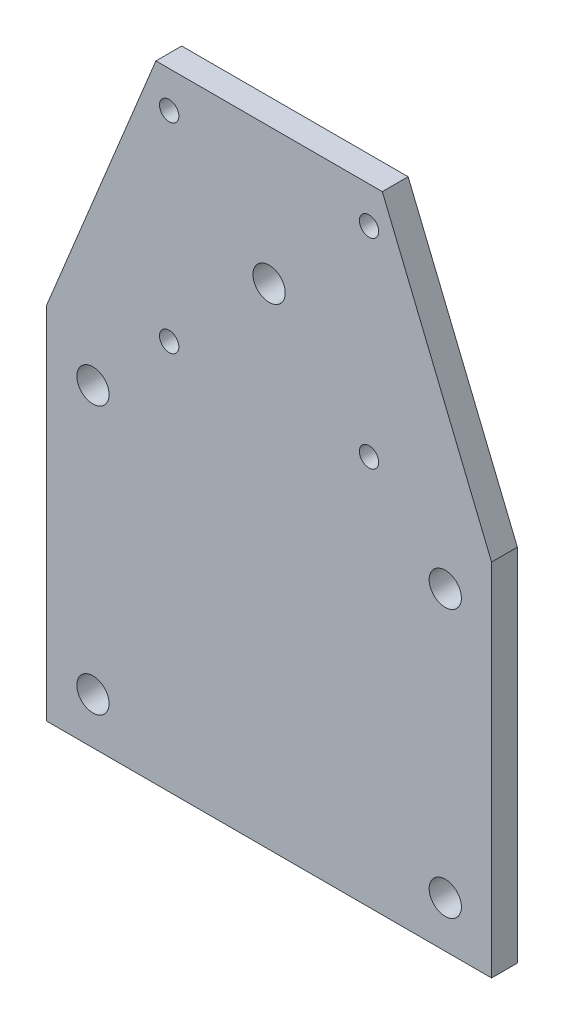
ISO-10303-21;
HEADER;
FILE_DESCRIPTION(('STEP AP214'),'2;1');
FILE_NAME('part.step','',(''),(''),'','','');
FILE_SCHEMA(('AUTOMOTIVE_DESIGN { 1 0 10303 214 1 1 1 1 }'));
ENDSEC;
DATA;
#1=APPLICATION_CONTEXT('core data for automotive mechanical design processes');
#2=APPLICATION_PROTOCOL_DEFINITION('international standard','automotive_design',2000,#1);
#3=PRODUCT_CONTEXT('',#1,'mechanical');
#4=PRODUCT('Part','Part','',(#3));
#5=PRODUCT_RELATED_PRODUCT_CATEGORY('part','',(#4));
#6=PRODUCT_DEFINITION_FORMATION('','',#4);
#7=PRODUCT_DEFINITION_CONTEXT('part definition',#1,'design');
#8=PRODUCT_DEFINITION('design','',#6,#7);
#9=PRODUCT_DEFINITION_SHAPE('','',#8);
#10=(LENGTH_UNIT() NAMED_UNIT(*) SI_UNIT(.MILLI.,.METRE.));
#11=(NAMED_UNIT(*) PLANE_ANGLE_UNIT() SI_UNIT($,.RADIAN.));
#12=(NAMED_UNIT(*) SI_UNIT($,.STERADIAN.) SOLID_ANGLE_UNIT());
#13=UNCERTAINTY_MEASURE_WITH_UNIT(LENGTH_MEASURE(1.E-05),#10,'distance_accuracy_value','');
#14=(GEOMETRIC_REPRESENTATION_CONTEXT(3) GLOBAL_UNCERTAINTY_ASSIGNED_CONTEXT((#13)) GLOBAL_UNIT_ASSIGNED_CONTEXT((#10,
#11,#12)) REPRESENTATION_CONTEXT('',''));
#15=CARTESIAN_POINT('',(0.,0.,0.));
#16=DIRECTION('',(0.,0.,1.));
#17=DIRECTION('',(1.,0.,0.));
#18=AXIS2_PLACEMENT_3D('',#15,#16,#17);
#19=CARTESIAN_POINT('',(-34.5047129725438,0.,4.));
#20=DIRECTION('',(1.,0.,0.));
#21=DIRECTION('',(0.,1.,0.));
#22=AXIS2_PLACEMENT_3D('',#19,#20,#21);
#23=PLANE('',#22);
#24=DIRECTION('',(0.,-1.,0.));
#25=VECTOR('',#24,1.);
#26=CARTESIAN_POINT('',(-34.5047129725438,0.,0.));
#27=LINE('',#26,#25);
#28=CARTESIAN_POINT('',(-34.5047129725438,-20.1363031788332,0.));
#29=VERTEX_POINT('',#28);
#30=CARTESIAN_POINT('',(-34.5047129725438,-76.0047129725436,0.));
#31=VERTEX_POINT('',#30);
#32=EDGE_CURVE('E158',#29,#31,#27,.T.);
#33=ORIENTED_EDGE('',*,*,#32,.T.);
#34=DIRECTION('',(0.,0.,-1.));
#35=VECTOR('',#34,1.);
#36=CARTESIAN_POINT('',(-34.5047129725438,-76.0047129725436,4.));
#37=LINE('',#36,#35);
#38=CARTESIAN_POINT('',(-34.5047129725438,-76.0047129725436,4.));
#39=VERTEX_POINT('',#38);
#40=EDGE_CURVE('E11',#39,#31,#37,.T.);
#41=ORIENTED_EDGE('',*,*,#40,.F.);
#42=DIRECTION('',(0.,-1.,0.));
#43=VECTOR('',#42,1.);
#44=CARTESIAN_POINT('',(-34.5047129725438,0.,4.));
#45=LINE('',#44,#43);
#46=CARTESIAN_POINT('',(-34.5047129725438,-20.1363031788332,4.));
#47=VERTEX_POINT('',#46);
#48=EDGE_CURVE('E403',#47,#39,#45,.T.);
#49=ORIENTED_EDGE('',*,*,#48,.F.);
#50=DIRECTION('',(0.,0.,-1.));
#51=VECTOR('',#50,1.);
#52=CARTESIAN_POINT('',(-34.5047129725438,-20.1363031788332,4.));
#53=LINE('',#52,#51);
#54=EDGE_CURVE('E62',#47,#29,#53,.T.);
#55=ORIENTED_EDGE('',*,*,#54,.T.);
#56=EDGE_LOOP('',(#33,#41,#49,#55));
#57=FACE_BOUND('',#56,.T.);
#58=ADVANCED_FACE('F45',(#57),#23,.F.);
#59=CARTESIAN_POINT('',(0.,-76.0047129725436,4.));
#60=DIRECTION('',(0.,1.,0.));
#61=DIRECTION('',(-1.,0.,0.));
#62=AXIS2_PLACEMENT_3D('',#59,#60,#61);
#63=PLANE('',#62);
#64=DIRECTION('',(1.,0.,0.));
#65=VECTOR('',#64,1.);
#66=CARTESIAN_POINT('',(0.,-76.0047129725436,0.));
#67=LINE('',#66,#65);
#68=CARTESIAN_POINT('',(34.5047129725438,-76.0047129725436,0.));
#69=VERTEX_POINT('',#68);
#70=EDGE_CURVE('E160',#31,#69,#67,.T.);
#71=ORIENTED_EDGE('',*,*,#70,.T.);
#72=DIRECTION('',(0.,0.,-1.));
#73=VECTOR('',#72,1.);
#74=CARTESIAN_POINT('',(34.5047129725438,-76.0047129725436,4.));
#75=LINE('',#74,#73);
#76=CARTESIAN_POINT('',(34.5047129725438,-76.0047129725436,4.));
#77=VERTEX_POINT('',#76);
#78=EDGE_CURVE('E54',#77,#69,#75,.T.);
#79=ORIENTED_EDGE('',*,*,#78,.F.);
#80=DIRECTION('',(1.,0.,0.));
#81=VECTOR('',#80,1.);
#82=CARTESIAN_POINT('',(0.,-76.0047129725436,4.));
#83=LINE('',#82,#81);
#84=EDGE_CURVE('E94',#39,#77,#83,.T.);
#85=ORIENTED_EDGE('',*,*,#84,.F.);
#86=ORIENTED_EDGE('',*,*,#40,.T.);
#87=EDGE_LOOP('',(#71,#79,#85,#86));
#88=FACE_BOUND('',#87,.T.);
#89=ADVANCED_FACE('F193',(#88),#63,.F.);
#90=CARTESIAN_POINT('',(34.5047129725438,0.,4.));
#91=DIRECTION('',(1.,0.,0.));
#92=DIRECTION('',(0.,0.,-1.));
#93=AXIS2_PLACEMENT_3D('',#90,#91,#92);
#94=PLANE('',#93);
#95=DIRECTION('',(0.,-1.,0.));
#96=VECTOR('',#95,1.);
#97=CARTESIAN_POINT('',(34.5047129725438,0.,0.));
#98=LINE('',#97,#96);
#99=CARTESIAN_POINT('',(34.5047129725438,-20.1363031788332,0.));
#100=VERTEX_POINT('',#99);
#101=EDGE_CURVE('E163',#100,#69,#98,.T.);
#102=ORIENTED_EDGE('',*,*,#101,.F.);
#103=DIRECTION('',(0.,0.,-1.));
#104=VECTOR('',#103,1.);
#105=CARTESIAN_POINT('',(34.5047129725438,-20.1363031788332,4.));
#106=LINE('',#105,#104);
#107=CARTESIAN_POINT('',(34.5047129725438,-20.1363031788332,4.));
#108=VERTEX_POINT('',#107);
#109=EDGE_CURVE('E113',#108,#100,#106,.T.);
#110=ORIENTED_EDGE('',*,*,#109,.F.);
#111=DIRECTION('',(0.,-1.,0.));
#112=VECTOR('',#111,1.);
#113=CARTESIAN_POINT('',(34.5047129725438,0.,4.));
#114=LINE('',#113,#112);
#115=EDGE_CURVE('E123',#108,#77,#114,.T.);
#116=ORIENTED_EDGE('',*,*,#115,.T.);
#117=ORIENTED_EDGE('',*,*,#78,.T.);
#118=EDGE_LOOP('',(#102,#110,#116,#117));
#119=FACE_BOUND('',#118,.T.);
#120=ADVANCED_FACE('F192',(#119),#94,.T.);
#121=CARTESIAN_POINT('',(22.4558516840694,9.21746788425806,4.));
#122=DIRECTION('',(0.925099008851072,0.379725985182427,0.));
#123=DIRECTION('',(-0.379725985182427,0.925099008851072,0.));
#124=AXIS2_PLACEMENT_3D('',#121,#122,#123);
#125=PLANE('',#124);
#126=DIRECTION('',(0.379725985182427,-0.925099008851072,0.));
#127=VECTOR('',#126,1.);
#128=CARTESIAN_POINT('',(22.4558516840694,9.21746788425806,0.));
#129=LINE('',#128,#127);
#130=CARTESIAN_POINT('',(17.5578975515723,21.15,0.));
#131=VERTEX_POINT('',#130);
#132=EDGE_CURVE('E109',#131,#100,#129,.T.);
#133=ORIENTED_EDGE('',*,*,#132,.F.);
#134=DIRECTION('',(0.,0.,-1.));
#135=VECTOR('',#134,1.);
#136=CARTESIAN_POINT('',(17.5578975515723,21.15,4.));
#137=LINE('',#136,#135);
#138=CARTESIAN_POINT('',(17.5578975515723,21.15,4.));
#139=VERTEX_POINT('',#138);
#140=EDGE_CURVE('E104',#139,#131,#137,.T.);
#141=ORIENTED_EDGE('',*,*,#140,.F.);
#142=DIRECTION('',(0.379725985182427,-0.925099008851072,0.));
#143=VECTOR('',#142,1.);
#144=CARTESIAN_POINT('',(22.4558516840694,9.21746788425806,4.));
#145=LINE('',#144,#143);
#146=EDGE_CURVE('E107',#139,#108,#145,.T.);
#147=ORIENTED_EDGE('',*,*,#146,.T.);
#148=ORIENTED_EDGE('',*,*,#109,.T.);
#149=EDGE_LOOP('',(#133,#141,#147,#148));
#150=FACE_BOUND('',#149,.T.);
#151=ADVANCED_FACE('F106',(#150),#125,.T.);
#152=CARTESIAN_POINT('',(0.,21.15,4.));
#153=DIRECTION('',(0.,1.,0.));
#154=DIRECTION('',(0.,0.,1.));
#155=AXIS2_PLACEMENT_3D('',#152,#153,#154);
#156=PLANE('',#155);
#157=DIRECTION('',(1.,0.,0.));
#158=VECTOR('',#157,1.);
#159=CARTESIAN_POINT('',(0.,21.15,0.));
#160=LINE('',#159,#158);
#161=CARTESIAN_POINT('',(-17.5578975515723,21.15,0.));
#162=VERTEX_POINT('',#161);
#163=EDGE_CURVE('E167',#162,#131,#160,.T.);
#164=ORIENTED_EDGE('',*,*,#163,.F.);
#165=DIRECTION('',(0.,0.,-1.));
#166=VECTOR('',#165,1.);
#167=CARTESIAN_POINT('',(-17.5578975515723,21.15,4.));
#168=LINE('',#167,#166);
#169=CARTESIAN_POINT('',(-17.5578975515723,21.15,4.));
#170=VERTEX_POINT('',#169);
#171=EDGE_CURVE('E82',#170,#162,#168,.T.);
#172=ORIENTED_EDGE('',*,*,#171,.F.);
#173=DIRECTION('',(1.,0.,0.));
#174=VECTOR('',#173,1.);
#175=CARTESIAN_POINT('',(0.,21.15,4.));
#176=LINE('',#175,#174);
#177=EDGE_CURVE('E121',#170,#139,#176,.T.);
#178=ORIENTED_EDGE('',*,*,#177,.T.);
#179=ORIENTED_EDGE('',*,*,#140,.T.);
#180=EDGE_LOOP('',(#164,#172,#178,#179));
#181=FACE_BOUND('',#180,.T.);
#182=ADVANCED_FACE('F125',(#181),#156,.T.);
#183=CARTESIAN_POINT('',(-15.5,15.5,4.));
#184=DIRECTION('',(0.,0.,-1.));
#185=DIRECTION('',(-1.,0.,0.));
#186=AXIS2_PLACEMENT_3D('',#183,#184,#185);
#187=CYLINDRICAL_SURFACE('',#186,1.5);
#188=CARTESIAN_POINT('',(-15.5,15.5,4.));
#189=DIRECTION('',(0.,0.,1.));
#190=DIRECTION('',(1.,0.,0.));
#191=AXIS2_PLACEMENT_3D('',#188,#189,#190);
#192=CIRCLE('',#191,1.5);
#193=CARTESIAN_POINT('',(-14.,15.5,4.));
#194=VERTEX_POINT('',#193);
#195=EDGE_CURVE('E140',#194,#194,#192,.T.);
#196=ORIENTED_EDGE('',*,*,#195,.T.);
#197=EDGE_LOOP('',(#196));
#198=FACE_BOUND('',#197,.T.);
#199=CARTESIAN_POINT('',(-15.5,15.5,0.));
#200=DIRECTION('',(0.,0.,1.));
#201=DIRECTION('',(1.,0.,0.));
#202=AXIS2_PLACEMENT_3D('',#199,#200,#201);
#203=CIRCLE('',#202,1.5);
#204=CARTESIAN_POINT('',(-14.,15.5,0.));
#205=VERTEX_POINT('',#204);
#206=EDGE_CURVE('E181',#205,#205,#203,.T.);
#207=ORIENTED_EDGE('',*,*,#206,.F.);
#208=EDGE_LOOP('',(#207));
#209=FACE_BOUND('',#208,.T.);
#210=ADVANCED_FACE('F257',(#198,#209),#187,.F.);
#211=CARTESIAN_POINT('',(15.5,15.5,4.));
#212=DIRECTION('',(0.,0.,-1.));
#213=DIRECTION('',(-1.,0.,0.));
#214=AXIS2_PLACEMENT_3D('',#211,#212,#213);
#215=CYLINDRICAL_SURFACE('',#214,1.5);
#216=CARTESIAN_POINT('',(15.5,15.5,4.));
#217=DIRECTION('',(0.,0.,1.));
#218=DIRECTION('',(1.,0.,0.));
#219=AXIS2_PLACEMENT_3D('',#216,#217,#218);
#220=CIRCLE('',#219,1.5);
#221=CARTESIAN_POINT('',(17.,15.5,4.));
#222=VERTEX_POINT('',#221);
#223=EDGE_CURVE('E137',#222,#222,#220,.T.);
#224=ORIENTED_EDGE('',*,*,#223,.T.);
#225=EDGE_LOOP('',(#224));
#226=FACE_BOUND('',#225,.T.);
#227=CARTESIAN_POINT('',(15.5,15.5,0.));
#228=DIRECTION('',(0.,0.,1.));
#229=DIRECTION('',(1.,0.,0.));
#230=AXIS2_PLACEMENT_3D('',#227,#228,#229);
#231=CIRCLE('',#230,1.5);
#232=CARTESIAN_POINT('',(17.,15.5,0.));
#233=VERTEX_POINT('',#232);
#234=EDGE_CURVE('E178',#233,#233,#231,.T.);
#235=ORIENTED_EDGE('',*,*,#234,.F.);
#236=EDGE_LOOP('',(#235));
#237=FACE_BOUND('',#236,.T.);
#238=ADVANCED_FACE('F260',(#226,#237),#215,.F.);
#239=CARTESIAN_POINT('',(15.5,-15.5,4.));
#240=DIRECTION('',(0.,0.,-1.));
#241=DIRECTION('',(-1.,0.,0.));
#242=AXIS2_PLACEMENT_3D('',#239,#240,#241);
#243=CYLINDRICAL_SURFACE('',#242,1.5);
#244=CARTESIAN_POINT('',(15.5,-15.5,4.));
#245=DIRECTION('',(0.,0.,1.));
#246=DIRECTION('',(1.,0.,0.));
#247=AXIS2_PLACEMENT_3D('',#244,#245,#246);
#248=CIRCLE('',#247,1.5);
#249=CARTESIAN_POINT('',(17.,-15.5,4.));
#250=VERTEX_POINT('',#249);
#251=EDGE_CURVE('E134',#250,#250,#248,.T.);
#252=ORIENTED_EDGE('',*,*,#251,.T.);
#253=EDGE_LOOP('',(#252));
#254=FACE_BOUND('',#253,.T.);
#255=CARTESIAN_POINT('',(15.5,-15.5,0.));
#256=DIRECTION('',(0.,0.,1.));
#257=DIRECTION('',(1.,0.,0.));
#258=AXIS2_PLACEMENT_3D('',#255,#256,#257);
#259=CIRCLE('',#258,1.5);
#260=CARTESIAN_POINT('',(17.,-15.5,0.));
#261=VERTEX_POINT('',#260);
#262=EDGE_CURVE('E175',#261,#261,#259,.T.);
#263=ORIENTED_EDGE('',*,*,#262,.F.);
#264=EDGE_LOOP('',(#263));
#265=FACE_BOUND('',#264,.T.);
#266=ADVANCED_FACE('F210',(#254,#265),#243,.F.);
#267=CARTESIAN_POINT('',(0.,0.,4.));
#268=DIRECTION('',(0.,0.,-1.));
#269=DIRECTION('',(-1.,0.,0.));
#270=AXIS2_PLACEMENT_3D('',#267,#268,#269);
#271=CYLINDRICAL_SURFACE('',#270,2.5);
#272=CARTESIAN_POINT('',(0.,0.,4.));
#273=DIRECTION('',(0.,0.,1.));
#274=DIRECTION('',(1.,0.,0.));
#275=AXIS2_PLACEMENT_3D('',#272,#273,#274);
#276=CIRCLE('',#275,2.5);
#277=CARTESIAN_POINT('',(2.50000000000001,0.,4.));
#278=VERTEX_POINT('',#277);
#279=EDGE_CURVE('E128',#278,#278,#276,.T.);
#280=ORIENTED_EDGE('',*,*,#279,.T.);
#281=EDGE_LOOP('',(#280));
#282=FACE_BOUND('',#281,.T.);
#283=CARTESIAN_POINT('',(0.,0.,0.));
#284=DIRECTION('',(0.,0.,1.));
#285=DIRECTION('',(1.,0.,0.));
#286=AXIS2_PLACEMENT_3D('',#283,#284,#285);
#287=CIRCLE('',#286,2.5);
#288=CARTESIAN_POINT('',(2.50000000000001,0.,0.));
#289=VERTEX_POINT('',#288);
#290=EDGE_CURVE('E172',#289,#289,#287,.T.);
#291=ORIENTED_EDGE('',*,*,#290,.F.);
#292=EDGE_LOOP('',(#291));
#293=FACE_BOUND('',#292,.T.);
#294=ADVANCED_FACE('F201',(#282,#293),#271,.F.);
#295=CARTESIAN_POINT('',(-22.4558516840694,9.21746788425805,4.));
#296=DIRECTION('',(-0.925099008851072,0.379725985182427,0.));
#297=DIRECTION('',(-0.379725985182427,-0.925099008851072,0.));
#298=AXIS2_PLACEMENT_3D('',#295,#296,#297);
#299=PLANE('',#298);
#300=DIRECTION('',(0.379725985182427,0.925099008851072,0.));
#301=VECTOR('',#300,1.);
#302=CARTESIAN_POINT('',(-22.4558516840694,9.21746788425805,0.));
#303=LINE('',#302,#301);
#304=EDGE_CURVE('E169',#29,#162,#303,.T.);
#305=ORIENTED_EDGE('',*,*,#304,.F.);
#306=ORIENTED_EDGE('',*,*,#54,.F.);
#307=DIRECTION('',(0.379725985182427,0.925099008851072,0.));
#308=VECTOR('',#307,1.);
#309=CARTESIAN_POINT('',(-22.4558516840694,9.21746788425805,4.));
#310=LINE('',#309,#308);
#311=EDGE_CURVE('E126',#47,#170,#310,.T.);
#312=ORIENTED_EDGE('',*,*,#311,.T.);
#313=ORIENTED_EDGE('',*,*,#171,.T.);
#314=EDGE_LOOP('',(#305,#306,#312,#313));
#315=FACE_BOUND('',#314,.T.);
#316=ADVANCED_FACE('F198',(#315),#299,.T.);
#317=CARTESIAN_POINT('',(-27.3205080756884,-27.3205080756884,4.));
#318=DIRECTION('',(0.,0.,-1.));
#319=DIRECTION('',(-1.,0.,0.));
#320=AXIS2_PLACEMENT_3D('',#317,#318,#319);
#321=CYLINDRICAL_SURFACE('',#320,2.5);
#322=CARTESIAN_POINT('',(-27.3205080756884,-27.3205080756884,4.));
#323=DIRECTION('',(0.,0.,1.));
#324=DIRECTION('',(1.,0.,0.));
#325=AXIS2_PLACEMENT_3D('',#322,#323,#324);
#326=CIRCLE('',#325,2.5);
#327=CARTESIAN_POINT('',(-24.8205080756884,-27.3205080756884,4.));
#328=VERTEX_POINT('',#327);
#329=EDGE_CURVE('E402',#328,#328,#326,.T.);
#330=ORIENTED_EDGE('',*,*,#329,.T.);
#331=EDGE_LOOP('',(#330));
#332=FACE_BOUND('',#331,.T.);
#333=CARTESIAN_POINT('',(-27.3205080756884,-27.3205080756884,0.));
#334=DIRECTION('',(0.,0.,1.));
#335=DIRECTION('',(1.,0.,0.));
#336=AXIS2_PLACEMENT_3D('',#333,#334,#335);
#337=CIRCLE('',#336,2.5);
#338=CARTESIAN_POINT('',(-24.8205080756884,-27.3205080756884,0.));
#339=VERTEX_POINT('',#338);
#340=EDGE_CURVE('E155',#339,#339,#337,.T.);
#341=ORIENTED_EDGE('',*,*,#340,.F.);
#342=EDGE_LOOP('',(#341));
#343=FACE_BOUND('',#342,.T.);
#344=ADVANCED_FACE('F200',(#332,#343),#321,.F.);
#345=CARTESIAN_POINT('',(27.3205080756885,-27.3205080756884,4.));
#346=DIRECTION('',(0.,0.,-1.));
#347=DIRECTION('',(-1.,0.,0.));
#348=AXIS2_PLACEMENT_3D('',#345,#346,#347);
#349=CYLINDRICAL_SURFACE('',#348,2.50000000000002);
#350=CARTESIAN_POINT('',(27.3205080756885,-27.3205080756884,4.));
#351=DIRECTION('',(0.,0.,1.));
#352=DIRECTION('',(1.,0.,0.));
#353=AXIS2_PLACEMENT_3D('',#350,#351,#352);
#354=CIRCLE('',#353,2.50000000000002);
#355=CARTESIAN_POINT('',(29.8205080756885,-27.3205080756884,4.));
#356=VERTEX_POINT('',#355);
#357=EDGE_CURVE('E399',#356,#356,#354,.F.);
#358=ORIENTED_EDGE('',*,*,#357,.F.);
#359=EDGE_LOOP('',(#358));
#360=FACE_BOUND('',#359,.T.);
#361=CARTESIAN_POINT('',(27.3205080756885,-27.3205080756884,0.));
#362=DIRECTION('',(0.,0.,1.));
#363=DIRECTION('',(1.,0.,0.));
#364=AXIS2_PLACEMENT_3D('',#361,#362,#363);
#365=CIRCLE('',#364,2.50000000000002);
#366=CARTESIAN_POINT('',(29.8205080756885,-27.3205080756884,0.));
#367=VERTEX_POINT('',#366);
#368=EDGE_CURVE('E152',#367,#367,#365,.F.);
#369=ORIENTED_EDGE('',*,*,#368,.T.);
#370=EDGE_LOOP('',(#369));
#371=FACE_BOUND('',#370,.T.);
#372=ADVANCED_FACE('F207',(#360,#371),#349,.F.);
#373=CARTESIAN_POINT('',(27.3205080756885,-68.8205080756884,4.));
#374=DIRECTION('',(0.,0.,-1.));
#375=DIRECTION('',(-1.,0.,0.));
#376=AXIS2_PLACEMENT_3D('',#373,#374,#375);
#377=CYLINDRICAL_SURFACE('',#376,2.50000000000001);
#378=CARTESIAN_POINT('',(27.3205080756885,-68.8205080756884,4.));
#379=DIRECTION('',(0.,0.,1.));
#380=DIRECTION('',(1.,0.,0.));
#381=AXIS2_PLACEMENT_3D('',#378,#379,#380);
#382=CIRCLE('',#381,2.50000000000001);
#383=CARTESIAN_POINT('',(29.8205080756885,-68.8205080756884,4.));
#384=VERTEX_POINT('',#383);
#385=EDGE_CURVE('E235',#384,#384,#382,.T.);
#386=ORIENTED_EDGE('',*,*,#385,.T.);
#387=EDGE_LOOP('',(#386));
#388=FACE_BOUND('',#387,.T.);
#389=CARTESIAN_POINT('',(27.3205080756885,-68.8205080756884,0.));
#390=DIRECTION('',(0.,0.,1.));
#391=DIRECTION('',(1.,0.,0.));
#392=AXIS2_PLACEMENT_3D('',#389,#390,#391);
#393=CIRCLE('',#392,2.50000000000001);
#394=CARTESIAN_POINT('',(29.8205080756885,-68.8205080756884,0.));
#395=VERTEX_POINT('',#394);
#396=EDGE_CURVE('E149',#395,#395,#393,.T.);
#397=ORIENTED_EDGE('',*,*,#396,.F.);
#398=EDGE_LOOP('',(#397));
#399=FACE_BOUND('',#398,.T.);
#400=ADVANCED_FACE('F223',(#388,#399),#377,.F.);
#401=CARTESIAN_POINT('',(-27.3205080756884,-68.8205080756884,4.));
#402=DIRECTION('',(0.,0.,-1.));
#403=DIRECTION('',(-1.,0.,0.));
#404=AXIS2_PLACEMENT_3D('',#401,#402,#403);
#405=CYLINDRICAL_SURFACE('',#404,2.5);
#406=CARTESIAN_POINT('',(-27.3205080756884,-68.8205080756884,4.));
#407=DIRECTION('',(0.,0.,1.));
#408=DIRECTION('',(1.,0.,0.));
#409=AXIS2_PLACEMENT_3D('',#406,#407,#408);
#410=CIRCLE('',#409,2.5);
#411=CARTESIAN_POINT('',(-24.8205080756884,-68.8205080756884,4.));
#412=VERTEX_POINT('',#411);
#413=EDGE_CURVE('E187',#412,#412,#410,.F.);
#414=ORIENTED_EDGE('',*,*,#413,.F.);
#415=EDGE_LOOP('',(#414));
#416=FACE_BOUND('',#415,.T.);
#417=CARTESIAN_POINT('',(-27.3205080756884,-68.8205080756884,0.));
#418=DIRECTION('',(0.,0.,1.));
#419=DIRECTION('',(1.,0.,0.));
#420=AXIS2_PLACEMENT_3D('',#417,#418,#419);
#421=CIRCLE('',#420,2.5);
#422=CARTESIAN_POINT('',(-24.8205080756884,-68.8205080756884,0.));
#423=VERTEX_POINT('',#422);
#424=EDGE_CURVE('E146',#423,#423,#421,.F.);
#425=ORIENTED_EDGE('',*,*,#424,.T.);
#426=EDGE_LOOP('',(#425));
#427=FACE_BOUND('',#426,.T.);
#428=ADVANCED_FACE('F47',(#416,#427),#405,.F.);
#429=CARTESIAN_POINT('',(-15.5,-15.5,4.));
#430=DIRECTION('',(0.,0.,-1.));
#431=DIRECTION('',(-1.,0.,0.));
#432=AXIS2_PLACEMENT_3D('',#429,#430,#431);
#433=CYLINDRICAL_SURFACE('',#432,1.5);
#434=CARTESIAN_POINT('',(-15.5,-15.5,4.));
#435=DIRECTION('',(0.,0.,1.));
#436=DIRECTION('',(1.,0.,0.));
#437=AXIS2_PLACEMENT_3D('',#434,#435,#436);
#438=CIRCLE('',#437,1.5);
#439=CARTESIAN_POINT('',(-14.,-15.5,4.));
#440=VERTEX_POINT('',#439);
#441=EDGE_CURVE('E143',#440,#440,#438,.T.);
#442=ORIENTED_EDGE('',*,*,#441,.T.);
#443=EDGE_LOOP('',(#442));
#444=FACE_BOUND('',#443,.T.);
#445=CARTESIAN_POINT('',(-15.5,-15.5,0.));
#446=DIRECTION('',(0.,0.,1.));
#447=DIRECTION('',(1.,0.,0.));
#448=AXIS2_PLACEMENT_3D('',#445,#446,#447);
#449=CIRCLE('',#448,1.5);
#450=CARTESIAN_POINT('',(-14.,-15.5,0.));
#451=VERTEX_POINT('',#450);
#452=EDGE_CURVE('E184',#451,#451,#449,.T.);
#453=ORIENTED_EDGE('',*,*,#452,.F.);
#454=EDGE_LOOP('',(#453));
#455=FACE_BOUND('',#454,.T.);
#456=ADVANCED_FACE('F230',(#444,#455),#433,.F.);
#457=CARTESIAN_POINT('',(0.,0.,4.));
#458=DIRECTION('',(0.,0.,1.));
#459=DIRECTION('',(1.,0.,0.));
#460=AXIS2_PLACEMENT_3D('',#457,#458,#459);
#461=PLANE('',#460);
#462=ORIENTED_EDGE('',*,*,#413,.T.);
#463=EDGE_LOOP('',(#462));
#464=FACE_BOUND('',#463,.T.);
#465=ORIENTED_EDGE('',*,*,#385,.F.);
#466=EDGE_LOOP('',(#465));
#467=FACE_BOUND('',#466,.T.);
#468=ORIENTED_EDGE('',*,*,#357,.T.);
#469=EDGE_LOOP('',(#468));
#470=FACE_BOUND('',#469,.T.);
#471=ORIENTED_EDGE('',*,*,#329,.F.);
#472=EDGE_LOOP('',(#471));
#473=FACE_BOUND('',#472,.T.);
#474=ORIENTED_EDGE('',*,*,#48,.T.);
#475=ORIENTED_EDGE('',*,*,#84,.T.);
#476=ORIENTED_EDGE('',*,*,#115,.F.);
#477=ORIENTED_EDGE('',*,*,#146,.F.);
#478=ORIENTED_EDGE('',*,*,#177,.F.);
#479=ORIENTED_EDGE('',*,*,#311,.F.);
#480=EDGE_LOOP('',(#474,#475,#476,#477,#478,#479));
#481=FACE_BOUND('',#480,.T.);
#482=ORIENTED_EDGE('',*,*,#279,.F.);
#483=EDGE_LOOP('',(#482));
#484=FACE_BOUND('',#483,.T.);
#485=ORIENTED_EDGE('',*,*,#251,.F.);
#486=EDGE_LOOP('',(#485));
#487=FACE_BOUND('',#486,.T.);
#488=ORIENTED_EDGE('',*,*,#223,.F.);
#489=EDGE_LOOP('',(#488));
#490=FACE_BOUND('',#489,.T.);
#491=ORIENTED_EDGE('',*,*,#195,.F.);
#492=EDGE_LOOP('',(#491));
#493=FACE_BOUND('',#492,.T.);
#494=ORIENTED_EDGE('',*,*,#441,.F.);
#495=EDGE_LOOP('',(#494));
#496=FACE_BOUND('',#495,.T.);
#497=ADVANCED_FACE('F118',(#464,#467,#470,#473,#481,#484,#487,#490,#493,#496),#461,.T.);
#498=CARTESIAN_POINT('',(0.,0.,0.));
#499=DIRECTION('',(0.,0.,1.));
#500=DIRECTION('',(1.,0.,0.));
#501=AXIS2_PLACEMENT_3D('',#498,#499,#500);
#502=PLANE('',#501);
#503=ORIENTED_EDGE('',*,*,#424,.F.);
#504=EDGE_LOOP('',(#503));
#505=FACE_BOUND('',#504,.T.);
#506=ORIENTED_EDGE('',*,*,#396,.T.);
#507=EDGE_LOOP('',(#506));
#508=FACE_BOUND('',#507,.T.);
#509=ORIENTED_EDGE('',*,*,#368,.F.);
#510=EDGE_LOOP('',(#509));
#511=FACE_BOUND('',#510,.T.);
#512=ORIENTED_EDGE('',*,*,#340,.T.);
#513=EDGE_LOOP('',(#512));
#514=FACE_BOUND('',#513,.T.);
#515=ORIENTED_EDGE('',*,*,#32,.F.);
#516=ORIENTED_EDGE('',*,*,#304,.T.);
#517=ORIENTED_EDGE('',*,*,#163,.T.);
#518=ORIENTED_EDGE('',*,*,#132,.T.);
#519=ORIENTED_EDGE('',*,*,#101,.T.);
#520=ORIENTED_EDGE('',*,*,#70,.F.);
#521=EDGE_LOOP('',(#515,#516,#517,#518,#519,#520));
#522=FACE_BOUND('',#521,.T.);
#523=ORIENTED_EDGE('',*,*,#290,.T.);
#524=EDGE_LOOP('',(#523));
#525=FACE_BOUND('',#524,.T.);
#526=ORIENTED_EDGE('',*,*,#262,.T.);
#527=EDGE_LOOP('',(#526));
#528=FACE_BOUND('',#527,.T.);
#529=ORIENTED_EDGE('',*,*,#234,.T.);
#530=EDGE_LOOP('',(#529));
#531=FACE_BOUND('',#530,.T.);
#532=ORIENTED_EDGE('',*,*,#206,.T.);
#533=EDGE_LOOP('',(#532));
#534=FACE_BOUND('',#533,.T.);
#535=ORIENTED_EDGE('',*,*,#452,.T.);
#536=EDGE_LOOP('',(#535));
#537=FACE_BOUND('',#536,.T.);
#538=ADVANCED_FACE('F196',(#505,#508,#511,#514,#522,#525,#528,#531,#534,#537),#502,.F.);
#539=CLOSED_SHELL('',(#58,#89,#120,#151,#182,#210,#238,#266,#294,#316,#344,#372,#400,#428,#456,
#497,#538));
#540=MANIFOLD_SOLID_BREP('B2',#539);
#541=ADVANCED_BREP_SHAPE_REPRESENTATION('',(#18,#540),#14);
#542=SHAPE_DEFINITION_REPRESENTATION(#9,#541);
ENDSEC;
END-ISO-10303-21;
